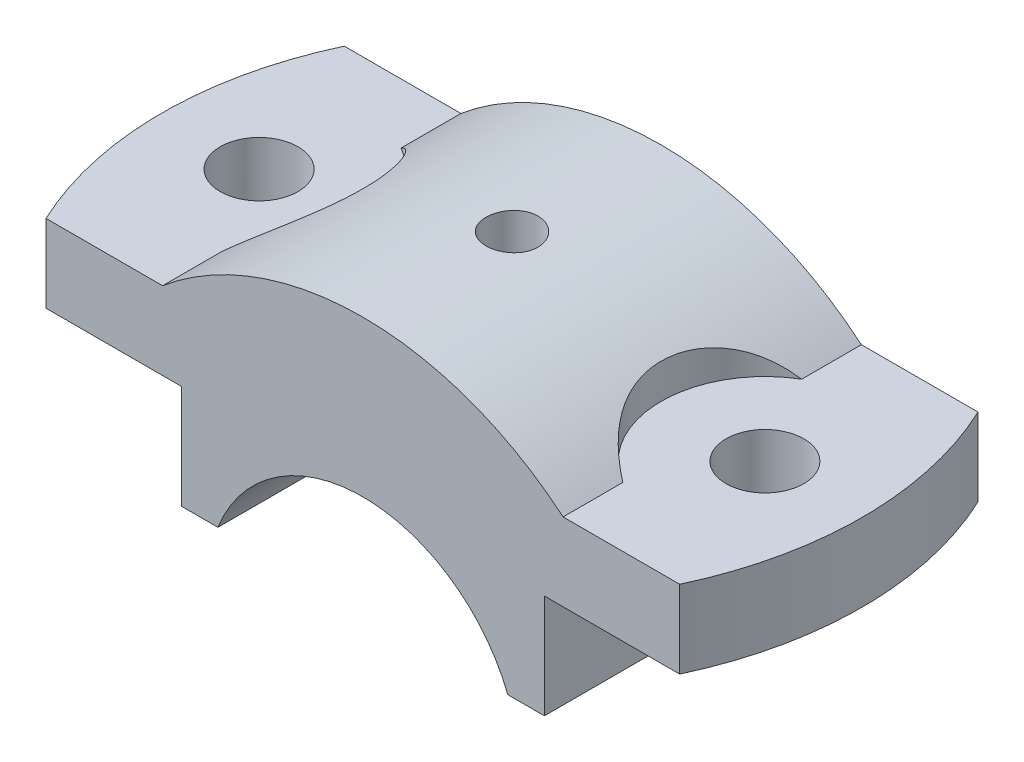
ISO-10303-21;
HEADER;
FILE_DESCRIPTION(('STEP AP214'),'2;1');
FILE_NAME('part.step','',(''),(''),'','','');
FILE_SCHEMA(('AUTOMOTIVE_DESIGN { 1 0 10303 214 1 1 1 1 }'));
ENDSEC;
DATA;
#1=APPLICATION_CONTEXT('core data for automotive mechanical design processes');
#2=APPLICATION_PROTOCOL_DEFINITION('international standard','automotive_design',2000,#1);
#3=PRODUCT_CONTEXT('',#1,'mechanical');
#4=PRODUCT('Part','Part','',(#3));
#5=PRODUCT_RELATED_PRODUCT_CATEGORY('part','',(#4));
#6=PRODUCT_DEFINITION_FORMATION('','',#4);
#7=PRODUCT_DEFINITION_CONTEXT('part definition',#1,'design');
#8=PRODUCT_DEFINITION('design','',#6,#7);
#9=PRODUCT_DEFINITION_SHAPE('','',#8);
#10=(LENGTH_UNIT() NAMED_UNIT(*) SI_UNIT(.MILLI.,.METRE.));
#11=(NAMED_UNIT(*) PLANE_ANGLE_UNIT() SI_UNIT($,.RADIAN.));
#12=(NAMED_UNIT(*) SI_UNIT($,.STERADIAN.) SOLID_ANGLE_UNIT());
#13=UNCERTAINTY_MEASURE_WITH_UNIT(LENGTH_MEASURE(1.E-05),#10,'distance_accuracy_value','');
#14=(GEOMETRIC_REPRESENTATION_CONTEXT(3) GLOBAL_UNCERTAINTY_ASSIGNED_CONTEXT((#13)) GLOBAL_UNIT_ASSIGNED_CONTEXT((#10,
#11,#12)) REPRESENTATION_CONTEXT('',''));
#15=CARTESIAN_POINT('',(0.,0.,0.));
#16=DIRECTION('',(0.,0.,1.));
#17=DIRECTION('',(1.,0.,0.));
#18=AXIS2_PLACEMENT_3D('',#15,#16,#17);
#19=CARTESIAN_POINT('',(0.,-32.925,23.));
#20=DIRECTION('',(0.,0.,-1.));
#21=DIRECTION('',(-1.,0.,0.));
#22=AXIS2_PLACEMENT_3D('',#19,#20,#21);
#23=CYLINDRICAL_SURFACE('',#22,48.);
#24=CARTESIAN_POINT('',(0.,15.0750000000001,4.));
#25=CARTESIAN_POINT('',(-0.224264359684817,15.0749978164607,3.99999020469488));
#26=CARTESIAN_POINT('',(-0.448681388720903,15.0734115417359,3.98107612075582));
#27=CARTESIAN_POINT('',(-0.891306282801559,15.06723609313,3.90590259257969));
#28=CARTESIAN_POINT('',(-1.10950682090092,15.0626435172678,3.84960083878039));
#29=CARTESIAN_POINT('',(-1.53322409005704,15.0509744498442,3.70129138476253));
#30=CARTESIAN_POINT('',(-1.73874792169846,15.0438993639395,3.60930388756073));
#31=CARTESIAN_POINT('',(-2.13138893366431,15.0280587097885,3.39227027251202));
#32=CARTESIAN_POINT('',(-2.31851003954156,15.0192935032544,3.26723122608997));
#33=CARTESIAN_POINT('',(-2.66955999986236,15.0010311946686,2.98729973357602));
#34=CARTESIAN_POINT('',(-2.83343548966465,14.9915324834631,2.83234046425725));
#35=CARTESIAN_POINT('',(-3.13288453414622,14.9728872321268,2.49710841660026));
#36=CARTESIAN_POINT('',(-3.26845684548602,14.9637407074816,2.31683452678951));
#37=CARTESIAN_POINT('',(-3.50763168956092,14.9468181064498,1.93576753160388));
#38=CARTESIAN_POINT('',(-3.61118733180617,14.9390440472037,1.73494489838891));
#39=CARTESIAN_POINT('',(-3.78308973509538,14.925764977931,1.31868681777607));
#40=CARTESIAN_POINT('',(-3.85143711804967,14.9202599278253,1.103251628567));
#41=CARTESIAN_POINT('',(-3.95082811927428,14.9121556826529,0.664418432475289));
#42=CARTESIAN_POINT('',(-3.9819586615591,14.9095497174488,0.441040240029591));
#43=CARTESIAN_POINT('',(-4.00630083206171,14.9075172928591,-0.00778481578146321));
#44=CARTESIAN_POINT('',(-3.99951317191816,14.9080907738024,-0.233231640244011));
#45=CARTESIAN_POINT('',(-3.94828345685939,14.9123462944655,-0.679198662042085));
#46=CARTESIAN_POINT('',(-3.90393587215223,14.9160205351142,-0.89972979630565));
#47=CARTESIAN_POINT('',(-3.77899194153176,14.9260513427747,-1.33020746957181));
#48=CARTESIAN_POINT('',(-3.69839524158714,14.932407935984,-1.54015390517541));
#49=CARTESIAN_POINT('',(-3.50313515260813,14.9470961882742,-1.94380362351239));
#50=CARTESIAN_POINT('',(-3.38842937902877,14.9554303020386,-2.13748631035003));
#51=CARTESIAN_POINT('',(-3.12823777565339,14.9731322745552,-2.50288535527922));
#52=CARTESIAN_POINT('',(-2.98275132249017,14.9825001542413,-2.67460126838886));
#53=CARTESIAN_POINT('',(-2.66459832890545,15.0012488164658,-2.99174167712626));
#54=CARTESIAN_POINT('',(-2.4918501175623,15.0106295510027,-3.13708425651701));
#55=CARTESIAN_POINT('',(-2.124362225487,15.0283196747934,-3.39671889355421));
#56=CARTESIAN_POINT('',(-1.92962253006135,15.0366290633315,-3.51101093045423));
#57=CARTESIAN_POINT('',(-1.5236263730714,15.0512418323856,-3.70529505067482));
#58=CARTESIAN_POINT('',(-1.3123681672363,15.0575450006978,-3.78528350591262));
#59=CARTESIAN_POINT('',(-0.879356276078327,15.067432696472,-3.90863252980531));
#60=CARTESIAN_POINT('',(-0.657602808675419,15.0710172803555,-3.95199385862105));
#61=CARTESIAN_POINT('',(-0.210605200657003,15.0750566777221,-4.00075505616631));
#62=CARTESIAN_POINT('',(0.0146265164607848,15.0755208196801,-4.00626807242759));
#63=CARTESIAN_POINT('',(0.462811010013214,15.0732919511481,-3.97947255749074));
#64=CARTESIAN_POINT('',(0.685763807685653,15.070598970107,-3.94716437908216));
#65=CARTESIAN_POINT('',(1.1227390248988,15.0623647136529,-3.84573736555962));
#66=CARTESIAN_POINT('',(1.33677370055889,15.0568274966969,-3.77667097589676));
#67=CARTESIAN_POINT('',(1.75021666032996,15.0435268044941,-3.60374164887188));
#68=CARTESIAN_POINT('',(1.94962471313253,15.0357632940497,-3.499878161366));
#69=CARTESIAN_POINT('',(2.32866887320763,15.0188570557453,-3.26001860313458));
#70=CARTESIAN_POINT('',(2.50825740208588,15.0097111287495,-3.12394757442069));
#71=CARTESIAN_POINT('',(2.84208437937448,14.991078345588,-2.82364377179807));
#72=CARTESIAN_POINT('',(2.99632238725753,14.9815914835011,-2.65941050860293));
#73=CARTESIAN_POINT('',(3.27545818182041,14.9633184486329,-2.30695323120664));
#74=CARTESIAN_POINT('',(3.40028213293455,14.954534074969,-2.1186706352104));
#75=CARTESIAN_POINT('',(3.61654025135807,14.9386860697729,-1.72375094854634));
#76=CARTESIAN_POINT('',(3.70797475203985,14.9316224210607,-1.51711404116025));
#77=CARTESIAN_POINT('',(3.85473270976226,14.9200257139577,-1.09161283784305));
#78=CARTESIAN_POINT('',(3.91010136579716,14.9154894891454,-0.872764221142675));
#79=CARTESIAN_POINT('',(3.98330307964061,14.9094506276341,-0.428837200502301));
#80=CARTESIAN_POINT('',(4.00113685827306,14.9079479326788,-0.20375891628162));
#81=CARTESIAN_POINT('',(3.99875425156372,14.9081471180078,0.245504504083582));
#82=CARTESIAN_POINT('',(3.97865387910956,14.9098392277228,0.469690268945751));
#83=CARTESIAN_POINT('',(3.90121545318012,14.9162166032923,0.911490134203404));
#84=CARTESIAN_POINT('',(3.84387734291051,14.9209018737119,1.12910422457536));
#85=CARTESIAN_POINT('',(3.69362044006825,14.9327350852682,1.55159105306647));
#86=CARTESIAN_POINT('',(3.60070373602613,14.9398828818476,1.75646453826275));
#87=CARTESIAN_POINT('',(3.381940235789,14.9558359950028,2.14772336229467));
#88=CARTESIAN_POINT('',(3.25609395645823,14.964641285562,2.3341089912533));
#89=CARTESIAN_POINT('',(2.97460776848979,14.9829492679473,2.68369495605204));
#90=CARTESIAN_POINT('',(2.81888197496584,14.9924539202298,2.84682603462939));
#91=CARTESIAN_POINT('',(2.48221290236986,15.0110718003872,3.14470074081327));
#92=CARTESIAN_POINT('',(2.30126353056437,15.020184932993,3.27943748998406));
#93=CARTESIAN_POINT('',(1.91893509211766,15.037009393691,3.51687944167025));
#94=CARTESIAN_POINT('',(1.71751862508215,15.0447180809242,3.61952455462531));
#95=CARTESIAN_POINT('',(1.30038300798293,15.057834100652,3.78940721220511));
#96=CARTESIAN_POINT('',(1.0846806216546,15.0632440771303,3.85668545715242));
#97=CARTESIAN_POINT('',(0.723088192386717,15.0697643093541,3.93679033000819));
#98=CARTESIAN_POINT('',(0.579523577753882,15.0717187550782,3.96046245006995));
#99=CARTESIAN_POINT('',(0.29066068600465,15.0743373063454,3.99207043870882));
#100=CARTESIAN_POINT('',(0.14536241349218,15.0750014153143,4.00000634906587));
#101=CARTESIAN_POINT('',(0.,15.0750000000001,4.));
#102=B_SPLINE_CURVE_WITH_KNOTS('',3,(#24,#25,#26,#27,#28,#29,#30,#31,#32,#33,#34,#35,#36,#37,
#38,#39,#40,#41,#42,#43,#44,#45,#46,#47,#48,#49,#50,#51,#52,#53,#54,#55,#56,#57,#58,#59,#60,#61,
#62,#63,#64,#65,#66,#67,#68,#69,#70,#71,#72,#73,#74,#75,#76,#77,#78,#79,#80,#81,#82,#83,#84,#85,
#86,#87,#88,#89,#90,#91,#92,#93,#94,#95,#96,#97,#98,#99,#100,#101),.UNSPECIFIED.,.T.,.F.,(4,2,2,
2,2,2,2,2,2,2,2,2,2,2,2,2,2,2,2,2,2,2,2,2,2,2,2,2,2,2,2,2,2,2,2,2,2,2,4),(0.,0.672262347200557,
1.34528675599134,2.01793069555582,2.69043083833673,3.36445067514306,4.03850011495726,
4.71353211804365,5.38855219711603,6.06199259326345,6.73542035050475,7.40715932441158,
8.07890485907995,8.75148862995597,9.4240860232344,10.098738037406,10.7733905023458,
11.448114303618,12.1228241013014,12.7955159722867,13.4682015685688,14.1399299612314,
14.8116689744549,15.4849869989971,16.15831672285,16.8333190596481,17.5083146567931,
18.1824626896371,18.8565977759503,19.5286745153011,20.2007522796936,20.8727905979009,
21.5448183683942,22.2188075465856,22.8929598092992,23.5683669225021,24.2429950636714,
24.6787394542665,25.1144826879498),.UNSPECIFIED.);
#103=CARTESIAN_POINT('',(0.,15.0750000000001,4.));
#104=VERTEX_POINT('',#103);
#105=EDGE_CURVE('E11',#104,#104,#102,.T.);
#106=ORIENTED_EDGE('',*,*,#105,.T.);
#107=EDGE_LOOP('',(#106));
#108=FACE_BOUND('',#107,.T.);
#109=CARTESIAN_POINT('',(30.8777832753584,3.825,-13.7851222511065));
#110=CARTESIAN_POINT('',(30.7149725169391,3.9617979615943,-13.6891933549574));
#111=CARTESIAN_POINT('',(30.552530768298,4.09643464080088,-13.5895964544436));
#112=CARTESIAN_POINT('',(30.2287634073527,4.36126535273428,-13.3829112105664));
#113=CARTESIAN_POINT('',(30.0674379112194,4.49145892844106,-13.275822099985));
#114=CARTESIAN_POINT('',(29.5855740854967,4.87529601936001,-12.9429902038733));
#115=CARTESIAN_POINT('',(29.2673308768097,5.12204303131721,-12.7057895110782));
#116=CARTESIAN_POINT('',(28.6395297724405,5.596850740133,-12.1993455863321));
#117=CARTESIAN_POINT('',(28.330015646874,5.8248255423898,-11.9299675440237));
#118=CARTESIAN_POINT('',(27.7252666171007,6.25979661223218,-11.3601454561043));
#119=CARTESIAN_POINT('',(27.4300280409067,6.46679828973796,-11.0597094623509));
#120=CARTESIAN_POINT('',(26.8565214720068,6.86003257474623,-10.4268507731623));
#121=CARTESIAN_POINT('',(26.5783501779554,7.04615105013512,-10.0942691965411));
#122=CARTESIAN_POINT('',(26.0449705876625,7.3957296827036,-9.39993894413395));
#123=CARTESIAN_POINT('',(25.7897645770861,7.5591875854182,-9.03818737192522));
#124=CARTESIAN_POINT('',(25.3071003862705,7.8626426579938,-8.28870866744372));
#125=CARTESIAN_POINT('',(25.0795768615277,8.00269537993376,-7.90104618979461));
#126=CARTESIAN_POINT('',(24.6553997695072,8.25961855372996,-7.10190198606952));
#127=CARTESIAN_POINT('',(24.4587422504942,8.37649197370856,-6.69042331839818));
#128=CARTESIAN_POINT('',(24.1175670194524,8.57654303937799,-5.88926283509116));
#129=CARTESIAN_POINT('',(23.9698037628071,8.66192002964219,-5.50150735933976));
#130=CARTESIAN_POINT('',(23.7040265127447,8.81398174680069,-4.71237681115331));
#131=CARTESIAN_POINT('',(23.5860107432916,8.88066758965293,-4.31100255343459));
#132=CARTESIAN_POINT('',(23.3813222455332,8.99549100010177,-3.49755546009834));
#133=CARTESIAN_POINT('',(23.2946631881197,9.0436204780967,-3.08547804183089));
#134=CARTESIAN_POINT('',(23.1539631530917,9.12140860022236,-2.25407439677455));
#135=CARTESIAN_POINT('',(23.099921237077,9.1510677757473,-1.83474837888606));
#136=CARTESIAN_POINT('',(23.0273196960242,9.1908418871181,-1.01618166101292));
#137=CARTESIAN_POINT('',(23.0069201069875,9.20197065396251,-0.617151949907131));
#138=CARTESIAN_POINT('',(22.9960465650476,9.20790744572019,0.181424729452022));
#139=CARTESIAN_POINT('',(23.0055712196029,9.20271623009298,0.580971672770798));
#140=CARTESIAN_POINT('',(23.0544223142842,9.17600212452397,1.37759590342016));
#141=CARTESIAN_POINT('',(23.0937419706337,9.15448295215759,1.77467373217766));
#142=CARTESIAN_POINT('',(23.2016919182266,9.09505807542287,2.56358487057347));
#143=CARTESIAN_POINT('',(23.2703223350159,9.05715230086638,2.95541815774062));
#144=CARTESIAN_POINT('',(23.4352272533706,8.96532017301225,3.72720024387177));
#145=CARTESIAN_POINT('',(23.5312217932651,8.91155588344212,4.10722823282197));
#146=CARTESIAN_POINT('',(23.7499495722107,8.78777585724035,4.8567869011893));
#147=CARTESIAN_POINT('',(23.8726824579731,8.71776033533235,5.22631771923063));
#148=CARTESIAN_POINT('',(24.1433391300255,8.56142630139817,5.95227962640707));
#149=CARTESIAN_POINT('',(24.2912518889445,8.47511492424454,6.30871636728665));
#150=CARTESIAN_POINT('',(24.610515985447,8.28612582884405,7.00642115225649));
#151=CARTESIAN_POINT('',(24.7818675285653,8.18344796707811,7.34768906329644));
#152=CARTESIAN_POINT('',(25.1493792267064,7.95966523515261,8.01932567752803));
#153=CARTESIAN_POINT('',(25.345945292509,7.83825017109675,8.34936876566029));
#154=CARTESIAN_POINT('',(25.7588669205266,7.57858296934698,8.98986056856912));
#155=CARTESIAN_POINT('',(25.9752230445931,7.44033035358799,9.30030872661082));
#156=CARTESIAN_POINT('',(26.4254432388807,7.14703766099231,9.90057962654112));
#157=CARTESIAN_POINT('',(26.6593307137433,6.99197501473357,10.1903737512634));
#158=CARTESIAN_POINT('',(27.1416475511412,6.66560159117878,10.7478054213092));
#159=CARTESIAN_POINT('',(27.390076209206,6.49429160076169,11.0154440384767));
#160=CARTESIAN_POINT('',(27.8976613398101,6.13670023017418,11.5268082162266));
#161=CARTESIAN_POINT('',(28.1567665586857,5.95048707254791,11.7706325445575));
#162=CARTESIAN_POINT('',(28.6841197127073,5.56302918617105,12.2354480651536));
#163=CARTESIAN_POINT('',(28.9523690683095,5.36178211620404,12.4564356882566));
#164=CARTESIAN_POINT('',(29.4946104877704,4.94562450377898,12.8749557609452));
#165=CARTESIAN_POINT('',(29.7685824418838,4.7307577069288,13.0725579897721));
#166=CARTESIAN_POINT('',(30.320637863792,4.28769761584668,13.4454353488078));
#167=CARTESIAN_POINT('',(30.5987191952422,4.05951107592107,13.6207216541841));
#168=CARTESIAN_POINT('',(30.8777832753584,3.825,13.7851222511065));
#169=B_SPLINE_CURVE_WITH_KNOTS('',3,(#109,#110,#111,#112,#113,#114,#115,#116,#117,#118,#119,
#120,#121,#122,#123,#124,#125,#126,#127,#128,#129,#130,#131,#132,#133,#134,#135,#136,#137,#138,
#139,#140,#141,#142,#143,#144,#145,#146,#147,#148,#149,#150,#151,#152,#153,#154,#155,#156,#157,
#158,#159,#160,#161,#162,#163,#164,#165,#166,#167,#168),.UNSPECIFIED.,.F.,.F.,(4,2,2,2,2,2,2,2,
2,2,2,2,2,2,2,2,2,2,2,2,2,2,2,2,2,2,2,2,2,4),(0.,0.699787166935759,1.39964609872419,
2.80014440804198,4.20673085545747,5.6129535517476,7.02652145885309,8.44022989885222,
9.85053372744997,11.2606568491027,12.5299720774548,13.7992115049867,15.0690036303624,
16.3387592218828,17.5364393378978,18.7340637200233,19.9314155068972,21.1287724223959,
22.3142937210228,23.4997993565322,24.6847871365273,25.8697853083517,27.0770660506098,
28.2843810789319,29.4933376280598,30.7022356557995,31.9058855980959,33.1097233759417,
34.3098732897197,35.5094198192169),.UNSPECIFIED.);
#170=CARTESIAN_POINT('',(30.8777832753584,3.825,-13.7851222511065));
#171=VERTEX_POINT('',#170);
#172=CARTESIAN_POINT('',(30.8777832753584,3.82499999999999,13.7851222511065));
#173=VERTEX_POINT('',#172);
#174=EDGE_CURVE('E136',#171,#173,#169,.T.);
#175=ORIENTED_EDGE('',*,*,#174,.F.);
#176=DIRECTION('',(0.,0.,-1.));
#177=VECTOR('',#176,1.);
#178=CARTESIAN_POINT('',(30.8777832753584,3.82499999999999,23.));
#179=LINE('',#178,#177);
#180=CARTESIAN_POINT('',(30.8777832753584,3.82499999999999,-23.));
#181=VERTEX_POINT('',#180);
#182=EDGE_CURVE('E142',#171,#181,#179,.T.);
#183=ORIENTED_EDGE('',*,*,#182,.T.);
#184=CARTESIAN_POINT('',(0.,-32.925,-23.));
#185=DIRECTION('',(0.,0.,1.));
#186=DIRECTION('',(1.,0.,0.));
#187=AXIS2_PLACEMENT_3D('',#184,#185,#186);
#188=CIRCLE('',#187,48.);
#189=CARTESIAN_POINT('',(-30.8777832753584,3.82499999999999,-23.));
#190=VERTEX_POINT('',#189);
#191=EDGE_CURVE('E311',#181,#190,#188,.T.);
#192=ORIENTED_EDGE('',*,*,#191,.T.);
#193=DIRECTION('',(0.,0.,-1.));
#194=VECTOR('',#193,1.);
#195=CARTESIAN_POINT('',(-30.8777832753584,3.82499999999999,23.));
#196=LINE('',#195,#194);
#197=CARTESIAN_POINT('',(-30.8777832753584,3.82499999999999,-13.7851222511065));
#198=VERTEX_POINT('',#197);
#199=EDGE_CURVE('E154',#198,#190,#196,.T.);
#200=ORIENTED_EDGE('',*,*,#199,.F.);
#201=CARTESIAN_POINT('',(-30.8777832753584,3.825,13.7851222511065));
#202=CARTESIAN_POINT('',(-30.7149725169391,3.9617979615943,13.6891933549574));
#203=CARTESIAN_POINT('',(-30.552530768298,4.09643464080088,13.5895964544436));
#204=CARTESIAN_POINT('',(-30.2287634073527,4.36126535273428,13.3829112105664));
#205=CARTESIAN_POINT('',(-30.0674379112194,4.49145892844106,13.275822099985));
#206=CARTESIAN_POINT('',(-29.5855740854968,4.87529601936002,12.9429902038733));
#207=CARTESIAN_POINT('',(-29.2673308768097,5.12204303131721,12.7057895110783));
#208=CARTESIAN_POINT('',(-28.6395297724405,5.596850740133,12.1993455863321));
#209=CARTESIAN_POINT('',(-28.3300156468739,5.82482554238979,11.9299675440237));
#210=CARTESIAN_POINT('',(-27.7252666171007,6.25979661223217,11.3601454561043));
#211=CARTESIAN_POINT('',(-27.4300280409067,6.46679828973795,11.0597094623509));
#212=CARTESIAN_POINT('',(-26.8565214720068,6.86003257474622,10.4268507731623));
#213=CARTESIAN_POINT('',(-26.5783501779554,7.04615105013511,10.0942691965411));
#214=CARTESIAN_POINT('',(-26.0449705876625,7.39572968270359,9.39993894413395));
#215=CARTESIAN_POINT('',(-25.7897645770862,7.5591875854182,9.03818737192523));
#216=CARTESIAN_POINT('',(-25.3071003862705,7.86264265799379,8.28870866744372));
#217=CARTESIAN_POINT('',(-25.0795768615277,8.00269537993375,7.90104618979462));
#218=CARTESIAN_POINT('',(-24.6553997695072,8.25961855372994,7.10190198606952));
#219=CARTESIAN_POINT('',(-24.4587422504942,8.37649197370855,6.69042331839819));
#220=CARTESIAN_POINT('',(-24.1175670194524,8.57654303937799,5.88926283509118));
#221=CARTESIAN_POINT('',(-23.9698037628071,8.6619200296422,5.50150735933977));
#222=CARTESIAN_POINT('',(-23.7040265127447,8.81398174680069,4.71237681115332));
#223=CARTESIAN_POINT('',(-23.5860107432916,8.88066758965293,4.31100255343459));
#224=CARTESIAN_POINT('',(-23.3813222455332,8.99549100010177,3.49755546009834));
#225=CARTESIAN_POINT('',(-23.2946631881197,9.0436204780967,3.08547804183089));
#226=CARTESIAN_POINT('',(-23.1539631530917,9.12140860022236,2.25407439677456));
#227=CARTESIAN_POINT('',(-23.099921237077,9.1510677757473,1.83474837888606));
#228=CARTESIAN_POINT('',(-23.0273196960242,9.1908418871181,1.01618166101292));
#229=CARTESIAN_POINT('',(-23.0069201069875,9.20197065396251,0.617151949907133));
#230=CARTESIAN_POINT('',(-22.9960465650476,9.20790744572019,-0.18142472945202));
#231=CARTESIAN_POINT('',(-23.0055712196029,9.20271623009298,-0.580971672770796));
#232=CARTESIAN_POINT('',(-23.0544223142842,9.17600212452397,-1.37759590342015));
#233=CARTESIAN_POINT('',(-23.0937419706337,9.15448295215759,-1.77467373217766));
#234=CARTESIAN_POINT('',(-23.2016919182266,9.09505807542287,-2.56358487057347));
#235=CARTESIAN_POINT('',(-23.2703223350159,9.05715230086638,-2.95541815774061));
#236=CARTESIAN_POINT('',(-23.4352272533706,8.96532017301225,-3.72720024387177));
#237=CARTESIAN_POINT('',(-23.5312217932651,8.91155588344213,-4.10722823282196));
#238=CARTESIAN_POINT('',(-23.7499495722106,8.78777585724036,-4.85678690118929));
#239=CARTESIAN_POINT('',(-23.8726824579731,8.71776033533235,-5.22631771923063));
#240=CARTESIAN_POINT('',(-24.1433391300255,8.56142630139817,-5.95227962640707));
#241=CARTESIAN_POINT('',(-24.2912518889445,8.47511492424454,-6.30871636728665));
#242=CARTESIAN_POINT('',(-24.610515985447,8.28612582884405,-7.00642115225649));
#243=CARTESIAN_POINT('',(-24.7818675285653,8.18344796707811,-7.34768906329644));
#244=CARTESIAN_POINT('',(-25.1493792267064,7.95966523515261,-8.01932567752803));
#245=CARTESIAN_POINT('',(-25.345945292509,7.83825017109675,-8.34936876566029));
#246=CARTESIAN_POINT('',(-25.7588669205266,7.57858296934698,-8.98986056856913));
#247=CARTESIAN_POINT('',(-25.9752230445931,7.44033035358799,-9.30030872661082));
#248=CARTESIAN_POINT('',(-26.4254432388807,7.14703766099231,-9.90057962654112));
#249=CARTESIAN_POINT('',(-26.6593307137433,6.99197501473356,-10.1903737512634));
#250=CARTESIAN_POINT('',(-27.1416475511412,6.66560159117878,-10.7478054213092));
#251=CARTESIAN_POINT('',(-27.390076209206,6.49429160076168,-11.0154440384767));
#252=CARTESIAN_POINT('',(-27.8976613398101,6.13670023017417,-11.5268082162266));
#253=CARTESIAN_POINT('',(-28.1567665586857,5.95048707254791,-11.7706325445576));
#254=CARTESIAN_POINT('',(-28.6841197127073,5.56302918617105,-12.2354480651536));
#255=CARTESIAN_POINT('',(-28.9523690683096,5.36178211620403,-12.4564356882566));
#256=CARTESIAN_POINT('',(-29.4946104877704,4.94562450377898,-12.8749557609452));
#257=CARTESIAN_POINT('',(-29.7685824418838,4.7307577069288,-13.0725579897721));
#258=CARTESIAN_POINT('',(-30.320637863792,4.28769761584668,-13.4454353488078));
#259=CARTESIAN_POINT('',(-30.5987191952422,4.05951107592107,-13.6207216541841));
#260=CARTESIAN_POINT('',(-30.8777832753584,3.825,-13.7851222511065));
#261=B_SPLINE_CURVE_WITH_KNOTS('',3,(#201,#202,#203,#204,#205,#206,#207,#208,#209,#210,#211,
#212,#213,#214,#215,#216,#217,#218,#219,#220,#221,#222,#223,#224,#225,#226,#227,#228,#229,#230,
#231,#232,#233,#234,#235,#236,#237,#238,#239,#240,#241,#242,#243,#244,#245,#246,#247,#248,#249,
#250,#251,#252,#253,#254,#255,#256,#257,#258,#259,#260),.UNSPECIFIED.,.F.,.F.,(4,2,2,2,2,2,2,2,
2,2,2,2,2,2,2,2,2,2,2,2,2,2,2,2,2,2,2,2,2,4),(0.,0.699787166935759,1.39964609872419,
2.80014440804197,4.20673085545746,5.61295355174759,7.02652145885308,8.4402298988522,
9.85053372744995,11.2606568491027,12.5299720774547,13.7992115049867,15.0690036303624,
16.3387592218828,17.5364393378978,18.7340637200233,19.9314155068972,21.1287724223959,
22.3142937210228,23.4997993565322,24.6847871365273,25.8697853083517,27.0770660506098,
28.2843810789319,29.4933376280598,30.7022356557995,31.9058855980959,33.1097233759417,
34.3098732897197,35.5094198192169),.UNSPECIFIED.);
#262=CARTESIAN_POINT('',(-30.8777832753584,3.82499999999998,13.7851222511065));
#263=VERTEX_POINT('',#262);
#264=EDGE_CURVE('E42',#263,#198,#261,.T.);
#265=ORIENTED_EDGE('',*,*,#264,.F.);
#266=CARTESIAN_POINT('',(-30.8777832753584,3.82499999999999,23.));
#267=VERTEX_POINT('',#266);
#268=EDGE_CURVE('E151',#267,#263,#196,.T.);
#269=ORIENTED_EDGE('',*,*,#268,.F.);
#270=CARTESIAN_POINT('',(0.,-32.925,23.));
#271=DIRECTION('',(0.,0.,1.));
#272=DIRECTION('',(1.,0.,0.));
#273=AXIS2_PLACEMENT_3D('',#270,#271,#272);
#274=CIRCLE('',#273,48.);
#275=CARTESIAN_POINT('',(30.8777832753584,3.82499999999999,23.));
#276=VERTEX_POINT('',#275);
#277=EDGE_CURVE('E338',#276,#267,#274,.T.);
#278=ORIENTED_EDGE('',*,*,#277,.F.);
#279=EDGE_CURVE('E145',#276,#173,#179,.T.);
#280=ORIENTED_EDGE('',*,*,#279,.T.);
#281=EDGE_LOOP('',(#175,#183,#192,#200,#265,#269,#278,#280));
#282=FACE_BOUND('',#281,.T.);
#283=ADVANCED_FACE('F33',(#108,#282),#23,.T.);
#284=CARTESIAN_POINT('',(0.,-32.925,23.));
#285=DIRECTION('',(0.,0.,1.));
#286=DIRECTION('',(1.,0.,0.));
#287=AXIS2_PLACEMENT_3D('',#284,#285,#286);
#288=PLANE('',#287);
#289=DIRECTION('',(-1.,0.,0.));
#290=VECTOR('',#289,1.);
#291=CARTESIAN_POINT('',(-54.,3.82499999999999,23.));
#292=LINE('',#291,#290);
#293=CARTESIAN_POINT('',(-48.8569340012244,3.82499999999999,23.));
#294=VERTEX_POINT('',#293);
#295=EDGE_CURVE('E340',#267,#294,#292,.T.);
#296=ORIENTED_EDGE('',*,*,#295,.T.);
#297=DIRECTION('',(0.,1.,0.));
#298=VECTOR('',#297,1.);
#299=CARTESIAN_POINT('',(-48.8569340012244,-42.175,23.));
#300=LINE('',#299,#298);
#301=CARTESIAN_POINT('',(-48.8569340012244,-8.175,23.));
#302=VERTEX_POINT('',#301);
#303=EDGE_CURVE('E356',#302,#294,#300,.T.);
#304=ORIENTED_EDGE('',*,*,#303,.F.);
#305=DIRECTION('',(1.,0.,0.));
#306=VECTOR('',#305,1.);
#307=CARTESIAN_POINT('',(-54.,-8.17500000000001,23.));
#308=LINE('',#307,#306);
#309=CARTESIAN_POINT('',(-28.,-8.17500000000001,23.));
#310=VERTEX_POINT('',#309);
#311=EDGE_CURVE('E314',#302,#310,#308,.T.);
#312=ORIENTED_EDGE('',*,*,#311,.T.);
#313=DIRECTION('',(0.,-1.,0.));
#314=VECTOR('',#313,1.);
#315=CARTESIAN_POINT('',(-28.,-8.17500000000001,23.));
#316=LINE('',#315,#314);
#317=CARTESIAN_POINT('',(-28.,-24.175,23.));
#318=VERTEX_POINT('',#317);
#319=EDGE_CURVE('E317',#310,#318,#316,.T.);
#320=ORIENTED_EDGE('',*,*,#319,.T.);
#321=DIRECTION('',(1.,0.,0.));
#322=VECTOR('',#321,1.);
#323=CARTESIAN_POINT('',(-28.,-24.175,23.));
#324=LINE('',#323,#322);
#325=CARTESIAN_POINT('',(-22.3480983531038,-24.175,23.));
#326=VERTEX_POINT('',#325);
#327=EDGE_CURVE('E294',#318,#326,#324,.T.);
#328=ORIENTED_EDGE('',*,*,#327,.T.);
#329=CARTESIAN_POINT('',(0.,-32.925,23.));
#330=DIRECTION('',(0.,0.,-1.));
#331=DIRECTION('',(1.,0.,0.));
#332=AXIS2_PLACEMENT_3D('',#329,#330,#331);
#333=CIRCLE('',#332,24.);
#334=CARTESIAN_POINT('',(22.3480983531038,-24.175,23.));
#335=VERTEX_POINT('',#334);
#336=EDGE_CURVE('E327',#326,#335,#333,.T.);
#337=ORIENTED_EDGE('',*,*,#336,.T.);
#338=DIRECTION('',(1.,0.,0.));
#339=VECTOR('',#338,1.);
#340=CARTESIAN_POINT('',(28.,-24.175,23.));
#341=LINE('',#340,#339);
#342=CARTESIAN_POINT('',(28.,-24.175,23.));
#343=VERTEX_POINT('',#342);
#344=EDGE_CURVE('E329',#335,#343,#341,.T.);
#345=ORIENTED_EDGE('',*,*,#344,.T.);
#346=DIRECTION('',(0.,1.,0.));
#347=VECTOR('',#346,1.);
#348=CARTESIAN_POINT('',(28.,-8.175,23.));
#349=LINE('',#348,#347);
#350=CARTESIAN_POINT('',(28.,-8.175,23.));
#351=VERTEX_POINT('',#350);
#352=EDGE_CURVE('E331',#343,#351,#349,.T.);
#353=ORIENTED_EDGE('',*,*,#352,.T.);
#354=DIRECTION('',(1.,0.,0.));
#355=VECTOR('',#354,1.);
#356=CARTESIAN_POINT('',(54.,-8.17499999999999,23.));
#357=LINE('',#356,#355);
#358=CARTESIAN_POINT('',(48.8569340012244,-8.175,23.));
#359=VERTEX_POINT('',#358);
#360=EDGE_CURVE('E333',#351,#359,#357,.T.);
#361=ORIENTED_EDGE('',*,*,#360,.T.);
#362=DIRECTION('',(0.,1.,0.));
#363=VECTOR('',#362,1.);
#364=CARTESIAN_POINT('',(48.8569340012244,-42.175,23.));
#365=LINE('',#364,#363);
#366=CARTESIAN_POINT('',(48.8569340012244,3.82499999999999,23.));
#367=VERTEX_POINT('',#366);
#368=EDGE_CURVE('E344',#359,#367,#365,.T.);
#369=ORIENTED_EDGE('',*,*,#368,.T.);
#370=DIRECTION('',(-1.,0.,0.));
#371=VECTOR('',#370,1.);
#372=CARTESIAN_POINT('',(54.,3.82500000000001,23.));
#373=LINE('',#372,#371);
#374=EDGE_CURVE('E336',#367,#276,#373,.T.);
#375=ORIENTED_EDGE('',*,*,#374,.T.);
#376=ORIENTED_EDGE('',*,*,#277,.T.);
#377=EDGE_LOOP('',(#296,#304,#312,#320,#328,#337,#345,#353,#361,#369,#375,#376));
#378=FACE_BOUND('',#377,.T.);
#379=ADVANCED_FACE('F215',(#378),#288,.T.);
#380=CARTESIAN_POINT('',(0.,-32.925,-23.));
#381=DIRECTION('',(0.,0.,1.));
#382=DIRECTION('',(1.,0.,0.));
#383=AXIS2_PLACEMENT_3D('',#380,#381,#382);
#384=PLANE('',#383);
#385=DIRECTION('',(0.,1.,0.));
#386=VECTOR('',#385,1.);
#387=CARTESIAN_POINT('',(-48.8569340012244,-42.175,-23.));
#388=LINE('',#387,#386);
#389=CARTESIAN_POINT('',(-48.8569340012244,-8.175,-23.));
#390=VERTEX_POINT('',#389);
#391=CARTESIAN_POINT('',(-48.8569340012244,3.82499999999999,-23.));
#392=VERTEX_POINT('',#391);
#393=EDGE_CURVE('E354',#390,#392,#388,.T.);
#394=ORIENTED_EDGE('',*,*,#393,.T.);
#395=DIRECTION('',(-1.,0.,0.));
#396=VECTOR('',#395,1.);
#397=CARTESIAN_POINT('',(-54.,3.82499999999999,-23.));
#398=LINE('',#397,#396);
#399=EDGE_CURVE('E312',#190,#392,#398,.T.);
#400=ORIENTED_EDGE('',*,*,#399,.F.);
#401=ORIENTED_EDGE('',*,*,#191,.F.);
#402=DIRECTION('',(-1.,0.,0.));
#403=VECTOR('',#402,1.);
#404=CARTESIAN_POINT('',(54.,3.82500000000001,-23.));
#405=LINE('',#404,#403);
#406=CARTESIAN_POINT('',(48.8569340012244,3.82499999999999,-23.));
#407=VERTEX_POINT('',#406);
#408=EDGE_CURVE('E149',#407,#181,#405,.T.);
#409=ORIENTED_EDGE('',*,*,#408,.F.);
#410=DIRECTION('',(0.,1.,0.));
#411=VECTOR('',#410,1.);
#412=CARTESIAN_POINT('',(48.8569340012244,-42.175,-23.));
#413=LINE('',#412,#411);
#414=CARTESIAN_POINT('',(48.8569340012244,-8.17499999999999,-23.));
#415=VERTEX_POINT('',#414);
#416=EDGE_CURVE('E175',#415,#407,#413,.T.);
#417=ORIENTED_EDGE('',*,*,#416,.F.);
#418=DIRECTION('',(1.,0.,0.));
#419=VECTOR('',#418,1.);
#420=CARTESIAN_POINT('',(54.,-8.17499999999999,-23.));
#421=LINE('',#420,#419);
#422=CARTESIAN_POINT('',(28.,-8.175,-23.));
#423=VERTEX_POINT('',#422);
#424=EDGE_CURVE('E307',#423,#415,#421,.T.);
#425=ORIENTED_EDGE('',*,*,#424,.F.);
#426=DIRECTION('',(0.,1.,0.));
#427=VECTOR('',#426,1.);
#428=CARTESIAN_POINT('',(28.,-8.175,-23.));
#429=LINE('',#428,#427);
#430=CARTESIAN_POINT('',(28.,-24.175,-23.));
#431=VERTEX_POINT('',#430);
#432=EDGE_CURVE('E305',#431,#423,#429,.T.);
#433=ORIENTED_EDGE('',*,*,#432,.F.);
#434=DIRECTION('',(1.,0.,0.));
#435=VECTOR('',#434,1.);
#436=CARTESIAN_POINT('',(28.,-24.175,-23.));
#437=LINE('',#436,#435);
#438=CARTESIAN_POINT('',(22.3480983531038,-24.175,-23.));
#439=VERTEX_POINT('',#438);
#440=EDGE_CURVE('E300',#439,#431,#437,.T.);
#441=ORIENTED_EDGE('',*,*,#440,.F.);
#442=CARTESIAN_POINT('',(0.,-32.925,-23.));
#443=DIRECTION('',(0.,0.,-1.));
#444=DIRECTION('',(1.,0.,0.));
#445=AXIS2_PLACEMENT_3D('',#442,#443,#444);
#446=CIRCLE('',#445,24.);
#447=CARTESIAN_POINT('',(-22.3480983531038,-24.175,-23.));
#448=VERTEX_POINT('',#447);
#449=EDGE_CURVE('E298',#448,#439,#446,.T.);
#450=ORIENTED_EDGE('',*,*,#449,.F.);
#451=DIRECTION('',(1.,0.,0.));
#452=VECTOR('',#451,1.);
#453=CARTESIAN_POINT('',(-28.,-24.175,-23.));
#454=LINE('',#453,#452);
#455=CARTESIAN_POINT('',(-28.,-24.175,-23.));
#456=VERTEX_POINT('',#455);
#457=EDGE_CURVE('E290',#456,#448,#454,.T.);
#458=ORIENTED_EDGE('',*,*,#457,.F.);
#459=DIRECTION('',(0.,-1.,0.));
#460=VECTOR('',#459,1.);
#461=CARTESIAN_POINT('',(-28.,-8.17500000000001,-23.));
#462=LINE('',#461,#460);
#463=CARTESIAN_POINT('',(-28.,-8.17500000000001,-23.));
#464=VERTEX_POINT('',#463);
#465=EDGE_CURVE('E284',#464,#456,#462,.T.);
#466=ORIENTED_EDGE('',*,*,#465,.F.);
#467=DIRECTION('',(1.,0.,0.));
#468=VECTOR('',#467,1.);
#469=CARTESIAN_POINT('',(-54.,-8.17500000000001,-23.));
#470=LINE('',#469,#468);
#471=EDGE_CURVE('E291',#390,#464,#470,.T.);
#472=ORIENTED_EDGE('',*,*,#471,.F.);
#473=EDGE_LOOP('',(#394,#400,#401,#409,#417,#425,#433,#441,#450,#458,#466,#472));
#474=FACE_BOUND('',#473,.T.);
#475=ADVANCED_FACE('F218',(#474),#384,.F.);
#476=CARTESIAN_POINT('',(-54.,-8.17500000000001,23.));
#477=DIRECTION('',(0.,1.,0.));
#478=DIRECTION('',(-1.,0.,0.));
#479=AXIS2_PLACEMENT_3D('',#476,#477,#478);
#480=PLANE('',#479);
#481=CARTESIAN_POINT('',(-39.,-8.175,0.));
#482=DIRECTION('',(0.,1.,0.));
#483=DIRECTION('',(-1.,0.,0.));
#484=AXIS2_PLACEMENT_3D('',#481,#482,#483);
#485=CIRCLE('',#484,5.99999999999999);
#486=CARTESIAN_POINT('',(-45.,-8.175,0.));
#487=VERTEX_POINT('',#486);
#488=EDGE_CURVE('E358',#487,#487,#485,.T.);
#489=ORIENTED_EDGE('',*,*,#488,.T.);
#490=EDGE_LOOP('',(#489));
#491=FACE_BOUND('',#490,.T.);
#492=ORIENTED_EDGE('',*,*,#311,.F.);
#493=CARTESIAN_POINT('',(0.,-8.17500000000001,0.));
#494=DIRECTION('',(0.,1.,0.));
#495=DIRECTION('',(-1.,0.,0.));
#496=AXIS2_PLACEMENT_3D('',#493,#494,#495);
#497=CIRCLE('',#496,54.);
#498=EDGE_CURVE('E350',#390,#302,#497,.T.);
#499=ORIENTED_EDGE('',*,*,#498,.F.);
#500=ORIENTED_EDGE('',*,*,#471,.T.);
#501=DIRECTION('',(0.,0.,-1.));
#502=VECTOR('',#501,1.);
#503=CARTESIAN_POINT('',(-28.,-8.17500000000001,23.));
#504=LINE('',#503,#502);
#505=EDGE_CURVE('E172',#310,#464,#504,.T.);
#506=ORIENTED_EDGE('',*,*,#505,.F.);
#507=EDGE_LOOP('',(#492,#499,#500,#506));
#508=FACE_BOUND('',#507,.T.);
#509=ADVANCED_FACE('F35',(#491,#508),#480,.F.);
#510=CARTESIAN_POINT('',(-54.,3.82499999999999,23.));
#511=DIRECTION('',(0.,-1.,0.));
#512=DIRECTION('',(0.,0.,-1.));
#513=AXIS2_PLACEMENT_3D('',#510,#511,#512);
#514=PLANE('',#513);
#515=CARTESIAN_POINT('',(-39.,3.82499999999999,0.));
#516=DIRECTION('',(0.,1.,0.));
#517=DIRECTION('',(0.,0.,1.));
#518=AXIS2_PLACEMENT_3D('',#515,#516,#517);
#519=CIRCLE('',#518,5.99999999999999);
#520=CARTESIAN_POINT('',(-39.,3.82499999999999,5.99999999999999));
#521=VERTEX_POINT('',#520);
#522=EDGE_CURVE('E361',#521,#521,#519,.T.);
#523=ORIENTED_EDGE('',*,*,#522,.F.);
#524=EDGE_LOOP('',(#523));
#525=FACE_BOUND('',#524,.T.);
#526=CARTESIAN_POINT('',(0.,3.82499999999999,0.));
#527=DIRECTION('',(0.,-1.,0.));
#528=DIRECTION('',(0.,0.,-1.));
#529=AXIS2_PLACEMENT_3D('',#526,#527,#528);
#530=CIRCLE('',#529,54.);
#531=EDGE_CURVE('E178',#294,#392,#530,.T.);
#532=ORIENTED_EDGE('',*,*,#531,.F.);
#533=ORIENTED_EDGE('',*,*,#295,.F.);
#534=ORIENTED_EDGE('',*,*,#268,.T.);
#535=CARTESIAN_POINT('',(-39.,3.82499999999998,0.));
#536=DIRECTION('',(0.,1.,0.));
#537=DIRECTION('',(-1.,0.,0.));
#538=AXIS2_PLACEMENT_3D('',#535,#536,#537);
#539=CIRCLE('',#538,16.);
#540=EDGE_CURVE('E57',#263,#198,#539,.T.);
#541=ORIENTED_EDGE('',*,*,#540,.T.);
#542=ORIENTED_EDGE('',*,*,#199,.T.);
#543=ORIENTED_EDGE('',*,*,#399,.T.);
#544=EDGE_LOOP('',(#532,#533,#534,#541,#542,#543));
#545=FACE_BOUND('',#544,.T.);
#546=ADVANCED_FACE('F222',(#525,#545),#514,.F.);
#547=CARTESIAN_POINT('',(54.,-8.17499999999999,23.));
#548=DIRECTION('',(0.,1.,0.));
#549=DIRECTION('',(-1.,0.,0.));
#550=AXIS2_PLACEMENT_3D('',#547,#548,#549);
#551=PLANE('',#550);
#552=CARTESIAN_POINT('',(39.,-8.175,0.));
#553=DIRECTION('',(0.,1.,0.));
#554=DIRECTION('',(-1.,0.,0.));
#555=AXIS2_PLACEMENT_3D('',#552,#553,#554);
#556=CIRCLE('',#555,5.99999999999999);
#557=CARTESIAN_POINT('',(33.,-8.175,0.));
#558=VERTEX_POINT('',#557);
#559=EDGE_CURVE('E364',#558,#558,#556,.T.);
#560=ORIENTED_EDGE('',*,*,#559,.T.);
#561=EDGE_LOOP('',(#560));
#562=FACE_BOUND('',#561,.T.);
#563=CARTESIAN_POINT('',(0.,-8.17500000000001,0.));
#564=DIRECTION('',(0.,1.,0.));
#565=DIRECTION('',(-1.,0.,0.));
#566=AXIS2_PLACEMENT_3D('',#563,#564,#565);
#567=CIRCLE('',#566,54.);
#568=EDGE_CURVE('E323',#359,#415,#567,.T.);
#569=ORIENTED_EDGE('',*,*,#568,.F.);
#570=ORIENTED_EDGE('',*,*,#360,.F.);
#571=DIRECTION('',(0.,0.,-1.));
#572=VECTOR('',#571,1.);
#573=CARTESIAN_POINT('',(28.,-8.175,23.));
#574=LINE('',#573,#572);
#575=EDGE_CURVE('E153',#351,#423,#574,.T.);
#576=ORIENTED_EDGE('',*,*,#575,.T.);
#577=ORIENTED_EDGE('',*,*,#424,.T.);
#578=EDGE_LOOP('',(#569,#570,#576,#577));
#579=FACE_BOUND('',#578,.T.);
#580=ADVANCED_FACE('F224',(#562,#579),#551,.F.);
#581=CARTESIAN_POINT('',(54.,3.82500000000001,23.));
#582=DIRECTION('',(0.,-1.,0.));
#583=DIRECTION('',(1.,0.,0.));
#584=AXIS2_PLACEMENT_3D('',#581,#582,#583);
#585=PLANE('',#584);
#586=CARTESIAN_POINT('',(39.,3.82499999999999,0.));
#587=DIRECTION('',(0.,1.,0.));
#588=DIRECTION('',(0.,0.,1.));
#589=AXIS2_PLACEMENT_3D('',#586,#587,#588);
#590=CIRCLE('',#589,5.99999999999999);
#591=CARTESIAN_POINT('',(39.,3.82499999999999,5.99999999999999));
#592=VERTEX_POINT('',#591);
#593=EDGE_CURVE('E367',#592,#592,#590,.T.);
#594=ORIENTED_EDGE('',*,*,#593,.F.);
#595=EDGE_LOOP('',(#594));
#596=FACE_BOUND('',#595,.T.);
#597=CARTESIAN_POINT('',(0.,3.82499999999999,0.));
#598=DIRECTION('',(0.,1.,0.));
#599=DIRECTION('',(0.,0.,1.));
#600=AXIS2_PLACEMENT_3D('',#597,#598,#599);
#601=CIRCLE('',#600,54.);
#602=EDGE_CURVE('E348',#367,#407,#601,.T.);
#603=ORIENTED_EDGE('',*,*,#602,.T.);
#604=ORIENTED_EDGE('',*,*,#408,.T.);
#605=ORIENTED_EDGE('',*,*,#182,.F.);
#606=CARTESIAN_POINT('',(39.,3.825,0.));
#607=DIRECTION('',(0.,1.,0.));
#608=DIRECTION('',(1.,0.,0.));
#609=AXIS2_PLACEMENT_3D('',#606,#607,#608);
#610=CIRCLE('',#609,16.);
#611=EDGE_CURVE('E49',#171,#173,#610,.T.);
#612=ORIENTED_EDGE('',*,*,#611,.T.);
#613=ORIENTED_EDGE('',*,*,#279,.F.);
#614=ORIENTED_EDGE('',*,*,#374,.F.);
#615=EDGE_LOOP('',(#603,#604,#605,#612,#613,#614));
#616=FACE_BOUND('',#615,.T.);
#617=ADVANCED_FACE('F147',(#596,#616),#585,.F.);
#618=CARTESIAN_POINT('',(-28.,-8.17500000000001,23.));
#619=DIRECTION('',(1.,0.,0.));
#620=DIRECTION('',(0.,1.,0.));
#621=AXIS2_PLACEMENT_3D('',#618,#619,#620);
#622=PLANE('',#621);
#623=ORIENTED_EDGE('',*,*,#465,.T.);
#624=DIRECTION('',(0.,0.,-1.));
#625=VECTOR('',#624,1.);
#626=CARTESIAN_POINT('',(-28.,-24.175,23.));
#627=LINE('',#626,#625);
#628=EDGE_CURVE('E169',#318,#456,#627,.T.);
#629=ORIENTED_EDGE('',*,*,#628,.F.);
#630=ORIENTED_EDGE('',*,*,#319,.F.);
#631=ORIENTED_EDGE('',*,*,#505,.T.);
#632=EDGE_LOOP('',(#623,#629,#630,#631));
#633=FACE_BOUND('',#632,.T.);
#634=ADVANCED_FACE('F274',(#633),#622,.F.);
#635=CARTESIAN_POINT('',(-28.,-24.175,23.));
#636=DIRECTION('',(0.,1.,0.));
#637=DIRECTION('',(-1.,0.,0.));
#638=AXIS2_PLACEMENT_3D('',#635,#636,#637);
#639=PLANE('',#638);
#640=ORIENTED_EDGE('',*,*,#457,.T.);
#641=DIRECTION('',(0.,0.,-1.));
#642=VECTOR('',#641,1.);
#643=CARTESIAN_POINT('',(-22.3480983531038,-24.175,23.));
#644=LINE('',#643,#642);
#645=EDGE_CURVE('E166',#326,#448,#644,.T.);
#646=ORIENTED_EDGE('',*,*,#645,.F.);
#647=ORIENTED_EDGE('',*,*,#327,.F.);
#648=ORIENTED_EDGE('',*,*,#628,.T.);
#649=EDGE_LOOP('',(#640,#646,#647,#648));
#650=FACE_BOUND('',#649,.T.);
#651=ADVANCED_FACE('F270',(#650),#639,.F.);
#652=CARTESIAN_POINT('',(0.,-32.925,23.));
#653=DIRECTION('',(0.,0.,-1.));
#654=DIRECTION('',(-1.,0.,0.));
#655=AXIS2_PLACEMENT_3D('',#652,#653,#654);
#656=CYLINDRICAL_SURFACE('',#655,24.);
#657=CARTESIAN_POINT('',(0.,-8.92499999999996,3.));
#658=CARTESIAN_POINT('',(0.167809314666914,-8.92500234124282,2.99999287087714));
#659=CARTESIAN_POINT('',(0.335723489163296,-8.92677858534114,2.98587254499686));
#660=CARTESIAN_POINT('',(0.666879362507703,-8.93369351866364,2.92976669451505));
#661=CARTESIAN_POINT('',(0.830115996748493,-8.93883571870281,2.88775207449193));
#662=CARTESIAN_POINT('',(1.14707468977566,-8.95190326746708,2.7771148273031));
#663=CARTESIAN_POINT('',(1.30080307217536,-8.95982674253345,2.70851010982817));
#664=CARTESIAN_POINT('',(1.59453536987164,-8.97757558946278,2.54667925923625));
#665=CARTESIAN_POINT('',(1.73454163386764,-8.98740063499056,2.45345734976314));
#666=CARTESIAN_POINT('',(1.99765538031758,-9.00791614432405,2.24448966019249));
#667=CARTESIAN_POINT('',(2.12067643792455,-9.01861062369095,2.12863544478451));
#668=CARTESIAN_POINT('',(2.34558335226899,-9.03962728788295,1.87792461175603));
#669=CARTESIAN_POINT('',(2.4474681316707,-9.04994945370874,1.7430670261041));
#670=CARTESIAN_POINT('',(2.62753219354073,-9.06909233256494,1.4576160269212));
#671=CARTESIAN_POINT('',(2.70563051512929,-9.07790787386502,1.30697116611847));
#672=CARTESIAN_POINT('',(2.83538769189014,-9.09298645850777,0.994575537663168));
#673=CARTESIAN_POINT('',(2.88704754967826,-9.09924959864233,0.832825191423584));
#674=CARTESIAN_POINT('',(2.96219877602972,-9.1084759247566,0.503706965295882));
#675=CARTESIAN_POINT('',(2.98583605767804,-9.11145619875902,0.336372890754968));
#676=CARTESIAN_POINT('',(3.00472265946868,-9.11383166228645,8.84838338005827E-05));
#677=CARTESIAN_POINT('',(2.9999731212029,-9.11322699598186,-0.168861783277548));
#678=CARTESIAN_POINT('',(2.96234068373748,-9.10851653556293,-0.502565792698538));
#679=CARTESIAN_POINT('',(2.92961851558164,-9.10443074447601,-0.667337983440315));
#680=CARTESIAN_POINT('',(2.83722045981846,-9.09324960290841,-0.989034025462783));
#681=CARTESIAN_POINT('',(2.77754402610228,-9.08615419145128,-1.14595771765685));
#682=CARTESIAN_POINT('',(2.63275867189398,-9.06973060962414,-1.44800159882602));
#683=CARTESIAN_POINT('',(2.54757990444916,-9.06039632146263,-1.59308796029878));
#684=CARTESIAN_POINT('',(2.3542577633483,-9.04055146283279,-1.8669680332959));
#685=CARTESIAN_POINT('',(2.24611333929693,-9.03004083857201,-1.99576099916842));
#686=CARTESIAN_POINT('',(2.00903893290454,-9.00893868131486,-2.23433125286729));
#687=CARTESIAN_POINT('',(1.87997040940802,-8.99834709135728,-2.34397091011918));
#688=CARTESIAN_POINT('',(1.60518860293671,-8.97834440932973,-2.54005065603666));
#689=CARTESIAN_POINT('',(1.4594752815819,-8.96893331998189,-2.6264906912064));
#690=CARTESIAN_POINT('',(1.15543400563618,-8.952346173377,-2.7737175845567));
#691=CARTESIAN_POINT('',(0.997101834405262,-8.94517086718152,-2.83449582465747));
#692=CARTESIAN_POINT('',(0.672369528517269,-8.93387057063922,-2.9285645922279));
#693=CARTESIAN_POINT('',(0.505969771956802,-8.92974543748952,-2.96185640656446));
#694=CARTESIAN_POINT('',(0.171015796696199,-8.92502884307084,-2.99982890911266));
#695=CARTESIAN_POINT('',(0.00248338823833095,-8.92441396628833,-3.00469919083688));
#696=CARTESIAN_POINT('',(-0.332995243796993,-8.9267239439348,-2.98619071913286));
#697=CARTESIAN_POINT('',(-0.499941501077646,-8.9296487229814,-2.96281256729809));
#698=CARTESIAN_POINT('',(-0.826949409265825,-8.93869477491965,-2.88862834947074));
#699=CARTESIAN_POINT('',(-0.987031884509644,-8.94480551023354,-2.83791268391684));
#700=CARTESIAN_POINT('',(-1.29641958583009,-8.9595393227976,-2.7105870577045));
#701=CARTESIAN_POINT('',(-1.44572444575838,-8.96816248535248,-2.63397621781029));
#702=CARTESIAN_POINT('',(-1.73016542482491,-8.98701812507862,-2.45657623499105));
#703=CARTESIAN_POINT('',(-1.86522451193258,-8.99725867148985,-2.35566445223324));
#704=CARTESIAN_POINT('',(-2.11655638755158,-9.01817829209208,-2.13270060295896));
#705=CARTESIAN_POINT('',(-2.23282843000423,-9.02885738367718,-2.01064769729881));
#706=CARTESIAN_POINT('',(-2.44395835058162,-9.04952273444895,-1.74803109989143));
#707=CARTESIAN_POINT('',(-2.53869055268152,-9.05950470334404,-1.60736598442753));
#708=CARTESIAN_POINT('',(-2.70318346733221,-9.07757506755418,-1.31201010617435));
#709=CARTESIAN_POINT('',(-2.77294468047404,-9.08566350082764,-1.15731962462818));
#710=CARTESIAN_POINT('',(-2.88531189463985,-9.09900179528402,-0.838709617022867));
#711=CARTESIAN_POINT('',(-2.92798875294853,-9.1042590577825,-0.674815403942437));
#712=CARTESIAN_POINT('',(-2.98520399264142,-9.1113610091105,-0.342117019463203));
#713=CARTESIAN_POINT('',(-2.99974368304292,-9.11320585669464,-0.173313076849201));
#714=CARTESIAN_POINT('',(-3.0002478433018,-9.1132694762105,0.163162715045612));
#715=CARTESIAN_POINT('',(-2.98640975723913,-9.11151330297652,0.330834297998263));
#716=CARTESIAN_POINT('',(-2.93096928581919,-9.10462662555354,0.661448555214091));
#717=CARTESIAN_POINT('',(-2.88936689748692,-9.09949612100298,0.824391228970552));
#718=CARTESIAN_POINT('',(-2.77964048842759,-9.08644661070536,1.14089634811968));
#719=CARTESIAN_POINT('',(-2.71152597716512,-9.07852860488655,1.29446213402618));
#720=CARTESIAN_POINT('',(-2.55072828258037,-9.06079460106213,1.58801598485798));
#721=CARTESIAN_POINT('',(-2.45804479141151,-9.050978579275,1.72800387962379));
#722=CARTESIAN_POINT('',(-2.25000759751901,-9.03047274297316,1.99143747040857));
#723=CARTESIAN_POINT('',(-2.13450675092995,-9.01977753499157,2.11476655314597));
#724=CARTESIAN_POINT('',(-1.88442027236206,-8.99876602088516,2.34036819020157));
#725=CARTESIAN_POINT('',(-1.74983014696988,-8.98844980469288,2.44263577292917));
#726=CARTESIAN_POINT('',(-1.46479874502506,-8.969315320959,2.62354242852635));
#727=CARTESIAN_POINT('',(-1.31429913551541,-8.96050289906035,2.7020901670791));
#728=CARTESIAN_POINT('',(-1.00221948276154,-8.94542821107926,2.83268549149954));
#729=CARTESIAN_POINT('',(-0.840651697044285,-8.93916317556506,2.88476187162415));
#730=CARTESIAN_POINT('',(-0.565206926361511,-8.931399356067,2.94847120580557));
#731=CARTESIAN_POINT('',(-0.453066796220305,-8.92901128925451,2.96776673037848));
#732=CARTESIAN_POINT('',(-0.227300475854921,-8.92581082404969,2.99353349483187));
#733=CARTESIAN_POINT('',(-0.113674296595232,-8.92499841403832,3.00000482927916));
#734=CARTESIAN_POINT('',(0.,-8.92499999999996,3.));
#735=B_SPLINE_CURVE_WITH_KNOTS('',3,(#657,#658,#659,#660,#661,#662,#663,#664,#665,#666,#667,
#668,#669,#670,#671,#672,#673,#674,#675,#676,#677,#678,#679,#680,#681,#682,#683,#684,#685,#686,
#687,#688,#689,#690,#691,#692,#693,#694,#695,#696,#697,#698,#699,#700,#701,#702,#703,#704,#705,
#706,#707,#708,#709,#710,#711,#712,#713,#714,#715,#716,#717,#718,#719,#720,#721,#722,#723,#724,
#725,#726,#727,#728,#729,#730,#731,#732,#733,#734),.UNSPECIFIED.,.T.,.F.,(4,2,2,2,2,2,2,2,2,2,2,
2,2,2,2,2,2,2,2,2,2,2,2,2,2,2,2,2,2,2,2,2,2,2,2,2,2,2,4),(0.,0.503012727331496,1.00655095313211,
1.50975060981812,2.01286398709288,2.51844975842211,3.02406129360013,3.53137500382643,
4.03866947396168,4.54331070343585,5.04793163861596,5.5496723573003,6.05142324199489,
6.5545611154264,7.05772200616366,7.564361737637,8.07100263735736,8.57781354877926,
9.08460073084536,9.58800335270305,10.0913952540231,10.5931326467207,11.0948870769474,
11.5992288351411,12.1035906165011,12.6108236580909,13.1180465306585,13.6239368913711,
14.1298037161275,14.6321628144266,15.1345219665546,15.6367010964779,16.1388865189472,
16.644422852302,17.1500783816402,17.6576568364422,18.1646819842084,18.5054261182515,
18.8461677396052),.UNSPECIFIED.);
#736=CARTESIAN_POINT('',(0.,-8.92499999999996,3.));
#737=VERTEX_POINT('',#736);
#738=EDGE_CURVE('E258',#737,#737,#735,.T.);
#739=ORIENTED_EDGE('',*,*,#738,.T.);
#740=EDGE_LOOP('',(#739));
#741=FACE_BOUND('',#740,.T.);
#742=ORIENTED_EDGE('',*,*,#449,.T.);
#743=DIRECTION('',(0.,0.,-1.));
#744=VECTOR('',#743,1.);
#745=CARTESIAN_POINT('',(22.3480983531038,-24.175,23.));
#746=LINE('',#745,#744);
#747=EDGE_CURVE('E163',#335,#439,#746,.T.);
#748=ORIENTED_EDGE('',*,*,#747,.F.);
#749=ORIENTED_EDGE('',*,*,#336,.F.);
#750=ORIENTED_EDGE('',*,*,#645,.T.);
#751=EDGE_LOOP('',(#742,#748,#749,#750));
#752=FACE_BOUND('',#751,.T.);
#753=ADVANCED_FACE('F264',(#741,#752),#656,.F.);
#754=CARTESIAN_POINT('',(28.,-24.175,23.));
#755=DIRECTION('',(0.,1.,0.));
#756=DIRECTION('',(0.,0.,1.));
#757=AXIS2_PLACEMENT_3D('',#754,#755,#756);
#758=PLANE('',#757);
#759=ORIENTED_EDGE('',*,*,#440,.T.);
#760=DIRECTION('',(0.,0.,-1.));
#761=VECTOR('',#760,1.);
#762=CARTESIAN_POINT('',(28.,-24.175,23.));
#763=LINE('',#762,#761);
#764=EDGE_CURVE('E160',#343,#431,#763,.T.);
#765=ORIENTED_EDGE('',*,*,#764,.F.);
#766=ORIENTED_EDGE('',*,*,#344,.F.);
#767=ORIENTED_EDGE('',*,*,#747,.T.);
#768=EDGE_LOOP('',(#759,#765,#766,#767));
#769=FACE_BOUND('',#768,.T.);
#770=ADVANCED_FACE('F269',(#769),#758,.F.);
#771=CARTESIAN_POINT('',(28.,-8.175,23.));
#772=DIRECTION('',(-1.,0.,0.));
#773=DIRECTION('',(0.,-1.,0.));
#774=AXIS2_PLACEMENT_3D('',#771,#772,#773);
#775=PLANE('',#774);
#776=ORIENTED_EDGE('',*,*,#432,.T.);
#777=ORIENTED_EDGE('',*,*,#575,.F.);
#778=ORIENTED_EDGE('',*,*,#352,.F.);
#779=ORIENTED_EDGE('',*,*,#764,.T.);
#780=EDGE_LOOP('',(#776,#777,#778,#779));
#781=FACE_BOUND('',#780,.T.);
#782=ADVANCED_FACE('F213',(#781),#775,.F.);
#783=CARTESIAN_POINT('',(0.,-42.175,0.));
#784=DIRECTION('',(0.,1.,0.));
#785=DIRECTION('',(0.,0.,1.));
#786=AXIS2_PLACEMENT_3D('',#783,#784,#785);
#787=CYLINDRICAL_SURFACE('',#786,54.);
#788=ORIENTED_EDGE('',*,*,#568,.T.);
#789=ORIENTED_EDGE('',*,*,#416,.T.);
#790=ORIENTED_EDGE('',*,*,#602,.F.);
#791=ORIENTED_EDGE('',*,*,#368,.F.);
#792=EDGE_LOOP('',(#788,#789,#790,#791));
#793=FACE_BOUND('',#792,.T.);
#794=ADVANCED_FACE('F209',(#793),#787,.T.);
#795=CARTESIAN_POINT('',(0.,-42.175,0.));
#796=DIRECTION('',(0.,1.,0.));
#797=DIRECTION('',(0.,0.,1.));
#798=AXIS2_PLACEMENT_3D('',#795,#796,#797);
#799=CYLINDRICAL_SURFACE('',#798,54.);
#800=ORIENTED_EDGE('',*,*,#498,.T.);
#801=ORIENTED_EDGE('',*,*,#303,.T.);
#802=ORIENTED_EDGE('',*,*,#531,.T.);
#803=ORIENTED_EDGE('',*,*,#393,.F.);
#804=EDGE_LOOP('',(#800,#801,#802,#803));
#805=FACE_BOUND('',#804,.T.);
#806=ADVANCED_FACE('F205',(#805),#799,.T.);
#807=CARTESIAN_POINT('',(-39.,-42.175,0.));
#808=DIRECTION('',(0.,1.,0.));
#809=DIRECTION('',(0.,0.,1.));
#810=AXIS2_PLACEMENT_3D('',#807,#808,#809);
#811=CYLINDRICAL_SURFACE('',#810,5.99999999999999);
#812=ORIENTED_EDGE('',*,*,#522,.T.);
#813=EDGE_LOOP('',(#812));
#814=FACE_BOUND('',#813,.T.);
#815=ORIENTED_EDGE('',*,*,#488,.F.);
#816=EDGE_LOOP('',(#815));
#817=FACE_BOUND('',#816,.T.);
#818=ADVANCED_FACE('F201',(#814,#817),#811,.F.);
#819=CARTESIAN_POINT('',(39.,-42.175,0.));
#820=DIRECTION('',(0.,1.,0.));
#821=DIRECTION('',(0.,0.,1.));
#822=AXIS2_PLACEMENT_3D('',#819,#820,#821);
#823=CYLINDRICAL_SURFACE('',#822,5.99999999999999);
#824=ORIENTED_EDGE('',*,*,#593,.T.);
#825=EDGE_LOOP('',(#824));
#826=FACE_BOUND('',#825,.T.);
#827=ORIENTED_EDGE('',*,*,#559,.F.);
#828=EDGE_LOOP('',(#827));
#829=FACE_BOUND('',#828,.T.);
#830=ADVANCED_FACE('F196',(#826,#829),#823,.F.);
#831=CARTESIAN_POINT('',(-39.,49.825,0.));
#832=DIRECTION('',(0.,-1.,0.));
#833=DIRECTION('',(1.,0.,0.));
#834=AXIS2_PLACEMENT_3D('',#831,#832,#833);
#835=CYLINDRICAL_SURFACE('',#834,16.);
#836=ORIENTED_EDGE('',*,*,#264,.T.);
#837=ORIENTED_EDGE('',*,*,#540,.F.);
#838=EDGE_LOOP('',(#836,#837));
#839=FACE_BOUND('',#838,.T.);
#840=ADVANCED_FACE('F191',(#839),#835,.F.);
#841=CARTESIAN_POINT('',(39.,49.825,0.));
#842=DIRECTION('',(0.,-1.,0.));
#843=DIRECTION('',(1.,0.,0.));
#844=AXIS2_PLACEMENT_3D('',#841,#842,#843);
#845=CYLINDRICAL_SURFACE('',#844,16.);
#846=ORIENTED_EDGE('',*,*,#174,.T.);
#847=ORIENTED_EDGE('',*,*,#611,.F.);
#848=EDGE_LOOP('',(#846,#847));
#849=FACE_BOUND('',#848,.T.);
#850=ADVANCED_FACE('F135',(#849),#845,.F.);
#851=CARTESIAN_POINT('',(0.,-0.924999999999947,0.));
#852=DIRECTION('',(0.,1.,0.));
#853=DIRECTION('',(0.,0.,1.));
#854=AXIS2_PLACEMENT_3D('',#851,#852,#853);
#855=CYLINDRICAL_SURFACE('',#854,4.);
#856=CARTESIAN_POINT('',(0.,-0.924999999999947,0.));
#857=DIRECTION('',(0.,1.,0.));
#858=DIRECTION('',(0.,0.,1.));
#859=AXIS2_PLACEMENT_3D('',#856,#857,#858);
#860=CIRCLE('',#859,4.);
#861=CARTESIAN_POINT('',(0.,-0.924999999999947,4.));
#862=VERTEX_POINT('',#861);
#863=EDGE_CURVE('E138',#862,#862,#860,.T.);
#864=ORIENTED_EDGE('',*,*,#863,.F.);
#865=EDGE_LOOP('',(#864));
#866=FACE_BOUND('',#865,.T.);
#867=ORIENTED_EDGE('',*,*,#105,.F.);
#868=EDGE_LOOP('',(#867));
#869=FACE_BOUND('',#868,.T.);
#870=ADVANCED_FACE('F240',(#866,#869),#855,.F.);
#871=CARTESIAN_POINT('',(0.,-0.924999999999947,0.));
#872=DIRECTION('',(0.,1.,0.));
#873=DIRECTION('',(0.,0.,1.));
#874=AXIS2_PLACEMENT_3D('',#871,#872,#873);
#875=PLANE('',#874);
#876=CARTESIAN_POINT('',(0.,-0.924999999999947,0.));
#877=DIRECTION('',(0.,1.,0.));
#878=DIRECTION('',(0.,0.,1.));
#879=AXIS2_PLACEMENT_3D('',#876,#877,#878);
#880=CIRCLE('',#879,3.);
#881=CARTESIAN_POINT('',(0.,-0.924999999999947,3.));
#882=VERTEX_POINT('',#881);
#883=EDGE_CURVE('E37',#882,#882,#880,.T.);
#884=ORIENTED_EDGE('',*,*,#883,.F.);
#885=EDGE_LOOP('',(#884));
#886=FACE_BOUND('',#885,.T.);
#887=ORIENTED_EDGE('',*,*,#863,.T.);
#888=EDGE_LOOP('',(#887));
#889=FACE_BOUND('',#888,.T.);
#890=ADVANCED_FACE('F242',(#886,#889),#875,.T.);
#891=CARTESIAN_POINT('',(0.,-24.175,0.));
#892=DIRECTION('',(0.,1.,0.));
#893=DIRECTION('',(0.,0.,1.));
#894=AXIS2_PLACEMENT_3D('',#891,#892,#893);
#895=CYLINDRICAL_SURFACE('',#894,3.);
#896=ORIENTED_EDGE('',*,*,#883,.T.);
#897=EDGE_LOOP('',(#896));
#898=FACE_BOUND('',#897,.T.);
#899=ORIENTED_EDGE('',*,*,#738,.F.);
#900=EDGE_LOOP('',(#899));
#901=FACE_BOUND('',#900,.T.);
#902=ADVANCED_FACE('F248',(#898,#901),#895,.F.);
#903=CLOSED_SHELL('',(#283,#379,#475,#509,#546,#580,#617,#634,#651,#753,#770,#782,#794,#806,
#818,#830,#840,#850,#870,#890,#902));
#904=MANIFOLD_SOLID_BREP('B2',#903);
#905=ADVANCED_BREP_SHAPE_REPRESENTATION('',(#18,#904),#14);
#906=SHAPE_DEFINITION_REPRESENTATION(#9,#905);
ENDSEC;
END-ISO-10303-21;
